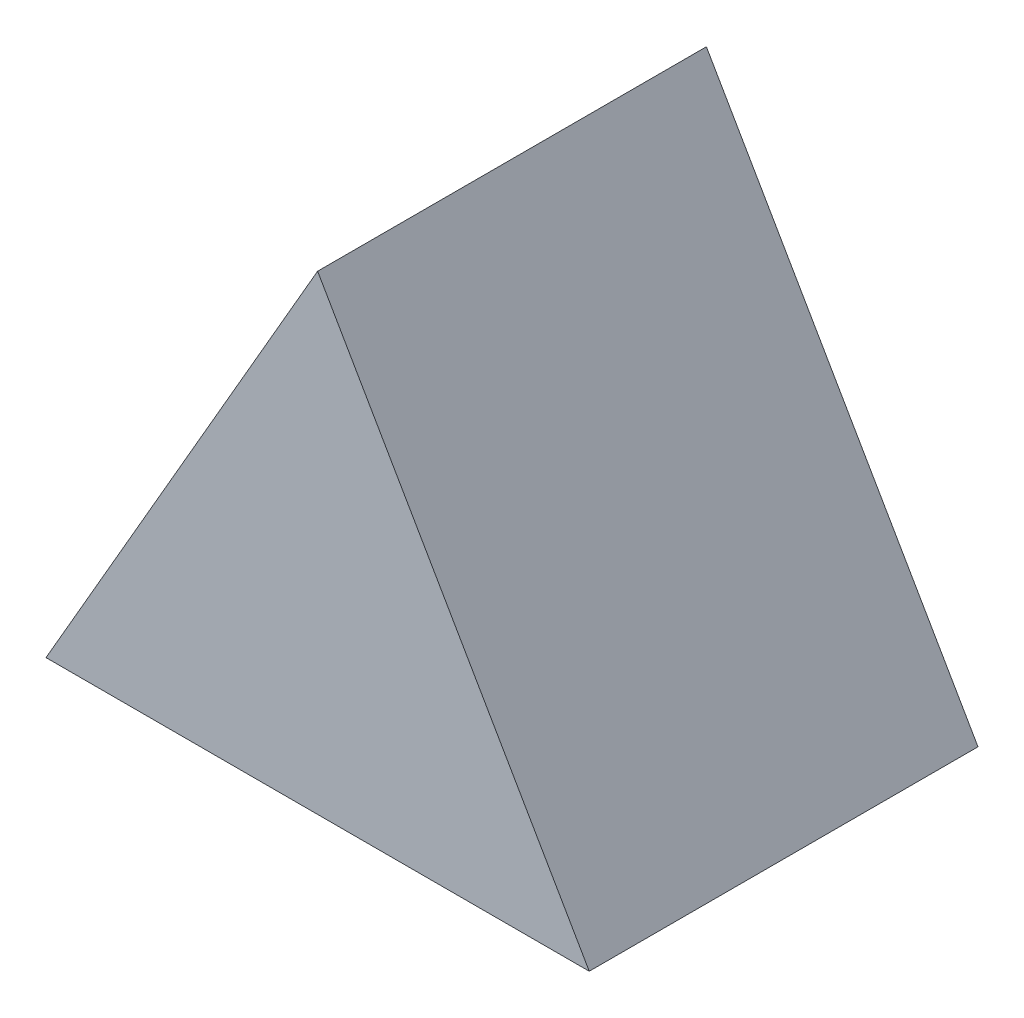
ISO-10303-21;
HEADER;
FILE_DESCRIPTION(('STEP AP214'),'2;1');
FILE_NAME('part.step','',(''),(''),'','','');
FILE_SCHEMA(('AUTOMOTIVE_DESIGN { 1 0 10303 214 1 1 1 1 }'));
ENDSEC;
DATA;
#1=APPLICATION_CONTEXT('core data for automotive mechanical design processes');
#2=APPLICATION_PROTOCOL_DEFINITION('international standard','automotive_design',2000,#1);
#3=PRODUCT_CONTEXT('',#1,'mechanical');
#4=PRODUCT('Part','Part','',(#3));
#5=PRODUCT_RELATED_PRODUCT_CATEGORY('part','',(#4));
#6=PRODUCT_DEFINITION_FORMATION('','',#4);
#7=PRODUCT_DEFINITION_CONTEXT('part definition',#1,'design');
#8=PRODUCT_DEFINITION('design','',#6,#7);
#9=PRODUCT_DEFINITION_SHAPE('','',#8);
#10=(LENGTH_UNIT() NAMED_UNIT(*) SI_UNIT(.MILLI.,.METRE.));
#11=(NAMED_UNIT(*) PLANE_ANGLE_UNIT() SI_UNIT($,.RADIAN.));
#12=(NAMED_UNIT(*) SI_UNIT($,.STERADIAN.) SOLID_ANGLE_UNIT());
#13=UNCERTAINTY_MEASURE_WITH_UNIT(LENGTH_MEASURE(1.E-05),#10,'distance_accuracy_value','');
#14=(GEOMETRIC_REPRESENTATION_CONTEXT(3) GLOBAL_UNCERTAINTY_ASSIGNED_CONTEXT((#13)) GLOBAL_UNIT_ASSIGNED_CONTEXT((#10,
#11,#12)) REPRESENTATION_CONTEXT('',''));
#15=CARTESIAN_POINT('',(0.,0.,0.));
#16=DIRECTION('',(0.,0.,1.));
#17=DIRECTION('',(1.,0.,0.));
#18=AXIS2_PLACEMENT_3D('',#15,#16,#17);
#19=CARTESIAN_POINT('',(0.,3.08264226555917,3.8));
#20=DIRECTION('',(0.866025403784439,-0.5,0.));
#21=DIRECTION('',(0.5,0.866025403784439,0.));
#22=AXIS2_PLACEMENT_3D('',#19,#20,#21);
#23=PLANE('',#22);
#24=DIRECTION('',(-0.5,-0.866025403784439,0.));
#25=VECTOR('',#24,1.);
#26=CARTESIAN_POINT('',(0.,3.08264226555917,0.));
#27=LINE('',#26,#25);
#28=CARTESIAN_POINT('',(0.,3.08264226555917,0.));
#29=VERTEX_POINT('',#28);
#30=CARTESIAN_POINT('',(-2.655,-1.5159526285362,0.));
#31=VERTEX_POINT('',#30);
#32=EDGE_CURVE('E84',#29,#31,#27,.T.);
#33=ORIENTED_EDGE('',*,*,#32,.T.);
#34=DIRECTION('',(0.,0.,-1.));
#35=VECTOR('',#34,1.);
#36=CARTESIAN_POINT('',(-2.655,-1.5159526285362,3.8));
#37=LINE('',#36,#35);
#38=CARTESIAN_POINT('',(-2.655,-1.5159526285362,3.8));
#39=VERTEX_POINT('',#38);
#40=EDGE_CURVE('E11',#39,#31,#37,.T.);
#41=ORIENTED_EDGE('',*,*,#40,.F.);
#42=DIRECTION('',(-0.5,-0.866025403784439,0.));
#43=VECTOR('',#42,1.);
#44=CARTESIAN_POINT('',(0.,3.08264226555917,3.8));
#45=LINE('',#44,#43);
#46=CARTESIAN_POINT('',(0.,3.08264226555917,3.8));
#47=VERTEX_POINT('',#46);
#48=EDGE_CURVE('E77',#47,#39,#45,.T.);
#49=ORIENTED_EDGE('',*,*,#48,.F.);
#50=DIRECTION('',(0.,0.,-1.));
#51=VECTOR('',#50,1.);
#52=CARTESIAN_POINT('',(0.,3.08264226555917,3.8));
#53=LINE('',#52,#51);
#54=EDGE_CURVE('E85',#47,#29,#53,.T.);
#55=ORIENTED_EDGE('',*,*,#54,.T.);
#56=EDGE_LOOP('',(#33,#41,#49,#55));
#57=FACE_BOUND('',#56,.T.);
#58=ADVANCED_FACE('F37',(#57),#23,.F.);
#59=CARTESIAN_POINT('',(-2.655,-1.5159526285362,3.8));
#60=DIRECTION('',(0.,1.,0.));
#61=DIRECTION('',(0.,0.,1.));
#62=AXIS2_PLACEMENT_3D('',#59,#60,#61);
#63=PLANE('',#62);
#64=DIRECTION('',(1.,0.,0.));
#65=VECTOR('',#64,1.);
#66=CARTESIAN_POINT('',(-2.655,-1.5159526285362,0.));
#67=LINE('',#66,#65);
#68=CARTESIAN_POINT('',(2.655,-1.5159526285362,0.));
#69=VERTEX_POINT('',#68);
#70=EDGE_CURVE('E65',#31,#69,#67,.T.);
#71=ORIENTED_EDGE('',*,*,#70,.T.);
#72=DIRECTION('',(0.,0.,-1.));
#73=VECTOR('',#72,1.);
#74=CARTESIAN_POINT('',(2.655,-1.5159526285362,3.8));
#75=LINE('',#74,#73);
#76=CARTESIAN_POINT('',(2.655,-1.5159526285362,3.8));
#77=VERTEX_POINT('',#76);
#78=EDGE_CURVE('E45',#77,#69,#75,.T.);
#79=ORIENTED_EDGE('',*,*,#78,.F.);
#80=DIRECTION('',(1.,0.,0.));
#81=VECTOR('',#80,1.);
#82=CARTESIAN_POINT('',(-2.655,-1.5159526285362,3.8));
#83=LINE('',#82,#81);
#84=EDGE_CURVE('E73',#39,#77,#83,.T.);
#85=ORIENTED_EDGE('',*,*,#84,.F.);
#86=ORIENTED_EDGE('',*,*,#40,.T.);
#87=EDGE_LOOP('',(#71,#79,#85,#86));
#88=FACE_BOUND('',#87,.T.);
#89=ADVANCED_FACE('F74',(#88),#63,.F.);
#90=CARTESIAN_POINT('',(2.655,-1.5159526285362,3.8));
#91=DIRECTION('',(-0.866025403784439,-0.5,0.));
#92=DIRECTION('',(0.5,-0.866025403784439,0.));
#93=AXIS2_PLACEMENT_3D('',#90,#91,#92);
#94=PLANE('',#93);
#95=DIRECTION('',(-0.5,0.866025403784439,0.));
#96=VECTOR('',#95,1.);
#97=CARTESIAN_POINT('',(2.655,-1.5159526285362,0.));
#98=LINE('',#97,#96);
#99=EDGE_CURVE('E70',#69,#29,#98,.T.);
#100=ORIENTED_EDGE('',*,*,#99,.T.);
#101=ORIENTED_EDGE('',*,*,#54,.F.);
#102=DIRECTION('',(-0.5,0.866025403784439,0.));
#103=VECTOR('',#102,1.);
#104=CARTESIAN_POINT('',(2.655,-1.5159526285362,3.8));
#105=LINE('',#104,#103);
#106=EDGE_CURVE('E53',#77,#47,#105,.T.);
#107=ORIENTED_EDGE('',*,*,#106,.F.);
#108=ORIENTED_EDGE('',*,*,#78,.T.);
#109=EDGE_LOOP('',(#100,#101,#107,#108));
#110=FACE_BOUND('',#109,.T.);
#111=ADVANCED_FACE('F92',(#110),#94,.F.);
#112=CARTESIAN_POINT('',(0.,0.,3.8));
#113=DIRECTION('',(0.,0.,1.));
#114=DIRECTION('',(1.,0.,0.));
#115=AXIS2_PLACEMENT_3D('',#112,#113,#114);
#116=PLANE('',#115);
#117=ORIENTED_EDGE('',*,*,#48,.T.);
#118=ORIENTED_EDGE('',*,*,#84,.T.);
#119=ORIENTED_EDGE('',*,*,#106,.T.);
#120=EDGE_LOOP('',(#117,#118,#119));
#121=FACE_BOUND('',#120,.T.);
#122=ADVANCED_FACE('F80',(#121),#116,.T.);
#123=CARTESIAN_POINT('',(0.,0.,0.));
#124=DIRECTION('',(0.,0.,1.));
#125=DIRECTION('',(1.,0.,0.));
#126=AXIS2_PLACEMENT_3D('',#123,#124,#125);
#127=PLANE('',#126);
#128=ORIENTED_EDGE('',*,*,#32,.F.);
#129=ORIENTED_EDGE('',*,*,#99,.F.);
#130=ORIENTED_EDGE('',*,*,#70,.F.);
#131=EDGE_LOOP('',(#128,#129,#130));
#132=FACE_BOUND('',#131,.T.);
#133=ADVANCED_FACE('F93',(#132),#127,.F.);
#134=CLOSED_SHELL('',(#58,#89,#111,#122,#133));
#135=MANIFOLD_SOLID_BREP('B2',#134);
#136=ADVANCED_BREP_SHAPE_REPRESENTATION('',(#18,#135),#14);
#137=SHAPE_DEFINITION_REPRESENTATION(#9,#136);
ENDSEC;
END-ISO-10303-21;
